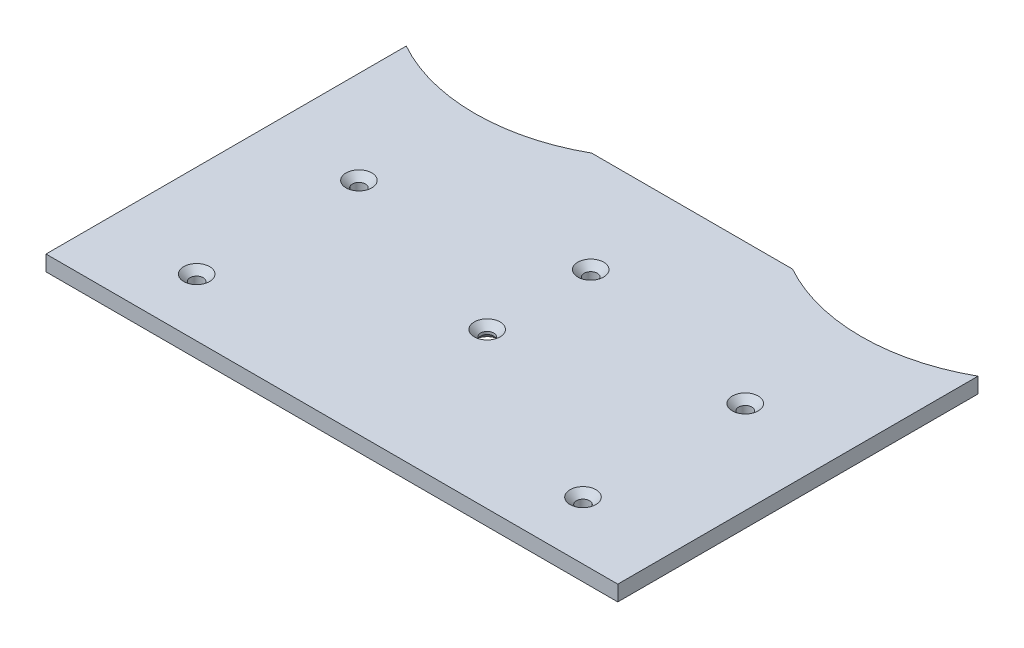
ISO-10303-21;
HEADER;
FILE_DESCRIPTION(('STEP AP214'),'2;1');
FILE_NAME('part.step','',(''),(''),'','','');
FILE_SCHEMA(('AUTOMOTIVE_DESIGN { 1 0 10303 214 1 1 1 1 }'));
ENDSEC;
DATA;
#1=APPLICATION_CONTEXT('core data for automotive mechanical design processes');
#2=APPLICATION_PROTOCOL_DEFINITION('international standard','automotive_design',2000,#1);
#3=PRODUCT_CONTEXT('',#1,'mechanical');
#4=PRODUCT('Part','Part','',(#3));
#5=PRODUCT_RELATED_PRODUCT_CATEGORY('part','',(#4));
#6=PRODUCT_DEFINITION_FORMATION('','',#4);
#7=PRODUCT_DEFINITION_CONTEXT('part definition',#1,'design');
#8=PRODUCT_DEFINITION('design','',#6,#7);
#9=PRODUCT_DEFINITION_SHAPE('','',#8);
#10=(LENGTH_UNIT() NAMED_UNIT(*) SI_UNIT(.MILLI.,.METRE.));
#11=(NAMED_UNIT(*) PLANE_ANGLE_UNIT() SI_UNIT($,.RADIAN.));
#12=(NAMED_UNIT(*) SI_UNIT($,.STERADIAN.) SOLID_ANGLE_UNIT());
#13=UNCERTAINTY_MEASURE_WITH_UNIT(LENGTH_MEASURE(1.E-05),#10,'distance_accuracy_value','');
#14=(GEOMETRIC_REPRESENTATION_CONTEXT(3) GLOBAL_UNCERTAINTY_ASSIGNED_CONTEXT((#13)) GLOBAL_UNIT_ASSIGNED_CONTEXT((#10,
#11,#12)) REPRESENTATION_CONTEXT('',''));
#15=CARTESIAN_POINT('',(0.,0.,0.));
#16=DIRECTION('',(0.,0.,1.));
#17=DIRECTION('',(1.,0.,0.));
#18=AXIS2_PLACEMENT_3D('',#15,#16,#17);
#19=CARTESIAN_POINT('',(50.,4.,-92.75));
#20=DIRECTION('',(0.,-1.,0.));
#21=DIRECTION('',(0.,0.,-1.));
#22=AXIS2_PLACEMENT_3D('',#19,#20,#21);
#23=CYLINDRICAL_SURFACE('',#22,49.25);
#24=CARTESIAN_POINT('',(50.,0.,-92.75));
#25=DIRECTION('',(0.,-1.,0.));
#26=DIRECTION('',(0.,0.,-1.));
#27=AXIS2_PLACEMENT_3D('',#24,#25,#26);
#28=CIRCLE('',#27,49.25);
#29=CARTESIAN_POINT('',(74.,0.,-49.7434597997002));
#30=VERTEX_POINT('',#29);
#31=CARTESIAN_POINT('',(26.0000000000001,0.,-49.7434597997002));
#32=VERTEX_POINT('',#31);
#33=EDGE_CURVE('E137',#30,#32,#28,.T.);
#34=ORIENTED_EDGE('',*,*,#33,.T.);
#35=DIRECTION('',(0.,-1.,0.));
#36=VECTOR('',#35,1.);
#37=CARTESIAN_POINT('',(26.0000000000001,4.,-49.7434597997002));
#38=LINE('',#37,#36);
#39=CARTESIAN_POINT('',(26.0000000000001,4.,-49.7434597997002));
#40=VERTEX_POINT('',#39);
#41=EDGE_CURVE('E159',#40,#32,#38,.T.);
#42=ORIENTED_EDGE('',*,*,#41,.F.);
#43=CARTESIAN_POINT('',(50.,4.,-92.75));
#44=DIRECTION('',(0.,-1.,0.));
#45=DIRECTION('',(0.,0.,-1.));
#46=AXIS2_PLACEMENT_3D('',#43,#44,#45);
#47=CIRCLE('',#46,49.25);
#48=CARTESIAN_POINT('',(74.,4.,-49.7434597997002));
#49=VERTEX_POINT('',#48);
#50=EDGE_CURVE('E98',#49,#40,#47,.T.);
#51=ORIENTED_EDGE('',*,*,#50,.F.);
#52=DIRECTION('',(0.,-1.,0.));
#53=VECTOR('',#52,1.);
#54=CARTESIAN_POINT('',(74.,4.,-49.7434597997002));
#55=LINE('',#54,#53);
#56=EDGE_CURVE('E163',#49,#30,#55,.T.);
#57=ORIENTED_EDGE('',*,*,#56,.T.);
#58=EDGE_LOOP('',(#34,#42,#51,#57));
#59=FACE_BOUND('',#58,.T.);
#60=ADVANCED_FACE('F41',(#59),#23,.F.);
#61=CARTESIAN_POINT('',(-26.0000000000001,4.,-49.7434597997002));
#62=DIRECTION('',(0.,0.,1.));
#63=DIRECTION('',(1.,0.,0.));
#64=AXIS2_PLACEMENT_3D('',#61,#62,#63);
#65=PLANE('',#64);
#66=DIRECTION('',(-1.,0.,0.));
#67=VECTOR('',#66,1.);
#68=CARTESIAN_POINT('',(-26.0000000000001,0.,-49.7434597997002));
#69=LINE('',#68,#67);
#70=CARTESIAN_POINT('',(-26.0000000000001,0.,-49.7434597997002));
#71=VERTEX_POINT('',#70);
#72=EDGE_CURVE('E140',#32,#71,#69,.T.);
#73=ORIENTED_EDGE('',*,*,#72,.T.);
#74=DIRECTION('',(0.,-1.,0.));
#75=VECTOR('',#74,1.);
#76=CARTESIAN_POINT('',(-26.0000000000001,4.,-49.7434597997002));
#77=LINE('',#76,#75);
#78=CARTESIAN_POINT('',(-26.0000000000001,4.,-49.7434597997002));
#79=VERTEX_POINT('',#78);
#80=EDGE_CURVE('E124',#79,#71,#77,.T.);
#81=ORIENTED_EDGE('',*,*,#80,.F.);
#82=DIRECTION('',(-1.,0.,0.));
#83=VECTOR('',#82,1.);
#84=CARTESIAN_POINT('',(-26.0000000000001,4.,-49.7434597997002));
#85=LINE('',#84,#83);
#86=EDGE_CURVE('E112',#40,#79,#85,.T.);
#87=ORIENTED_EDGE('',*,*,#86,.F.);
#88=ORIENTED_EDGE('',*,*,#41,.T.);
#89=EDGE_LOOP('',(#73,#81,#87,#88));
#90=FACE_BOUND('',#89,.T.);
#91=ADVANCED_FACE('F235',(#90),#65,.F.);
#92=CARTESIAN_POINT('',(-50.,4.,-92.75));
#93=DIRECTION('',(0.,-1.,0.));
#94=DIRECTION('',(0.,0.,-1.));
#95=AXIS2_PLACEMENT_3D('',#92,#93,#94);
#96=CYLINDRICAL_SURFACE('',#95,49.25);
#97=CARTESIAN_POINT('',(-50.,0.,-92.75));
#98=DIRECTION('',(0.,-1.,0.));
#99=DIRECTION('',(0.,0.,1.));
#100=AXIS2_PLACEMENT_3D('',#97,#98,#99);
#101=CIRCLE('',#100,49.25);
#102=CARTESIAN_POINT('',(-74.,0.,-49.7434597997002));
#103=VERTEX_POINT('',#102);
#104=EDGE_CURVE('E122',#71,#103,#101,.T.);
#105=ORIENTED_EDGE('',*,*,#104,.T.);
#106=DIRECTION('',(0.,-1.,0.));
#107=VECTOR('',#106,1.);
#108=CARTESIAN_POINT('',(-74.,4.,-49.7434597997002));
#109=LINE('',#108,#107);
#110=CARTESIAN_POINT('',(-74.,4.,-49.7434597997002));
#111=VERTEX_POINT('',#110);
#112=EDGE_CURVE('E119',#111,#103,#109,.T.);
#113=ORIENTED_EDGE('',*,*,#112,.F.);
#114=CARTESIAN_POINT('',(-50.,4.,-92.75));
#115=DIRECTION('',(0.,-1.,0.));
#116=DIRECTION('',(0.,0.,1.));
#117=AXIS2_PLACEMENT_3D('',#114,#115,#116);
#118=CIRCLE('',#117,49.25);
#119=EDGE_CURVE('E106',#79,#111,#118,.T.);
#120=ORIENTED_EDGE('',*,*,#119,.F.);
#121=ORIENTED_EDGE('',*,*,#80,.T.);
#122=EDGE_LOOP('',(#105,#113,#120,#121));
#123=FACE_BOUND('',#122,.T.);
#124=ADVANCED_FACE('F120',(#123),#96,.F.);
#125=CARTESIAN_POINT('',(-74.,4.,43.5));
#126=DIRECTION('',(1.,0.,0.));
#127=DIRECTION('',(0.,0.,-1.));
#128=AXIS2_PLACEMENT_3D('',#125,#126,#127);
#129=PLANE('',#128);
#130=DIRECTION('',(0.,0.,1.));
#131=VECTOR('',#130,1.);
#132=CARTESIAN_POINT('',(-74.,0.,43.5));
#133=LINE('',#132,#131);
#134=CARTESIAN_POINT('',(-74.,0.,43.5));
#135=VERTEX_POINT('',#134);
#136=EDGE_CURVE('E83',#103,#135,#133,.T.);
#137=ORIENTED_EDGE('',*,*,#136,.T.);
#138=DIRECTION('',(0.,-1.,0.));
#139=VECTOR('',#138,1.);
#140=CARTESIAN_POINT('',(-74.,4.,43.5));
#141=LINE('',#140,#139);
#142=CARTESIAN_POINT('',(-74.,4.,43.5));
#143=VERTEX_POINT('',#142);
#144=EDGE_CURVE('E125',#143,#135,#141,.T.);
#145=ORIENTED_EDGE('',*,*,#144,.F.);
#146=DIRECTION('',(0.,0.,1.));
#147=VECTOR('',#146,1.);
#148=CARTESIAN_POINT('',(-74.,4.,-43.5));
#149=LINE('',#148,#147);
#150=EDGE_CURVE('E110',#111,#143,#149,.T.);
#151=ORIENTED_EDGE('',*,*,#150,.F.);
#152=ORIENTED_EDGE('',*,*,#112,.T.);
#153=EDGE_LOOP('',(#137,#145,#151,#152));
#154=FACE_BOUND('',#153,.T.);
#155=ADVANCED_FACE('F127',(#154),#129,.F.);
#156=CARTESIAN_POINT('',(-74.,4.,43.5));
#157=DIRECTION('',(0.,0.,-1.));
#158=DIRECTION('',(-1.,0.,0.));
#159=AXIS2_PLACEMENT_3D('',#156,#157,#158);
#160=PLANE('',#159);
#161=DIRECTION('',(1.,0.,0.));
#162=VECTOR('',#161,1.);
#163=CARTESIAN_POINT('',(-74.,0.,43.5));
#164=LINE('',#163,#162);
#165=CARTESIAN_POINT('',(74.,0.,43.5));
#166=VERTEX_POINT('',#165);
#167=EDGE_CURVE('E90',#135,#166,#164,.T.);
#168=ORIENTED_EDGE('',*,*,#167,.T.);
#169=DIRECTION('',(0.,-1.,0.));
#170=VECTOR('',#169,1.);
#171=CARTESIAN_POINT('',(74.,4.,43.5));
#172=LINE('',#171,#170);
#173=CARTESIAN_POINT('',(74.,4.,43.5));
#174=VERTEX_POINT('',#173);
#175=EDGE_CURVE('E133',#174,#166,#172,.T.);
#176=ORIENTED_EDGE('',*,*,#175,.F.);
#177=DIRECTION('',(1.,0.,0.));
#178=VECTOR('',#177,1.);
#179=CARTESIAN_POINT('',(-74.,4.,43.5));
#180=LINE('',#179,#178);
#181=EDGE_CURVE('E130',#143,#174,#180,.T.);
#182=ORIENTED_EDGE('',*,*,#181,.F.);
#183=ORIENTED_EDGE('',*,*,#144,.T.);
#184=EDGE_LOOP('',(#168,#176,#182,#183));
#185=FACE_BOUND('',#184,.T.);
#186=ADVANCED_FACE('F319',(#185),#160,.F.);
#187=CARTESIAN_POINT('',(74.,4.,43.5));
#188=DIRECTION('',(-1.,0.,0.));
#189=DIRECTION('',(0.,0.,1.));
#190=AXIS2_PLACEMENT_3D('',#187,#188,#189);
#191=PLANE('',#190);
#192=DIRECTION('',(0.,0.,-1.));
#193=VECTOR('',#192,1.);
#194=CARTESIAN_POINT('',(74.,0.,43.5));
#195=LINE('',#194,#193);
#196=EDGE_CURVE('E150',#166,#30,#195,.T.);
#197=ORIENTED_EDGE('',*,*,#196,.T.);
#198=ORIENTED_EDGE('',*,*,#56,.F.);
#199=DIRECTION('',(0.,0.,-1.));
#200=VECTOR('',#199,1.);
#201=CARTESIAN_POINT('',(74.,4.,-49.7434597997002));
#202=LINE('',#201,#200);
#203=EDGE_CURVE('E60',#174,#49,#202,.T.);
#204=ORIENTED_EDGE('',*,*,#203,.F.);
#205=ORIENTED_EDGE('',*,*,#175,.T.);
#206=EDGE_LOOP('',(#197,#198,#204,#205));
#207=FACE_BOUND('',#206,.T.);
#208=ADVANCED_FACE('F318',(#207),#191,.F.);
#209=CARTESIAN_POINT('',(-50.,4.,-92.75));
#210=DIRECTION('',(0.,1.,0.));
#211=DIRECTION('',(0.,0.,1.));
#212=AXIS2_PLACEMENT_3D('',#209,#210,#211);
#213=PLANE('',#212);
#214=CARTESIAN_POINT('',(0.,4.,3.3));
#215=DIRECTION('',(0.,1.,0.));
#216=DIRECTION('',(0.,0.,1.));
#217=AXIS2_PLACEMENT_3D('',#214,#215,#216);
#218=CIRCLE('',#217,3.34999999999998);
#219=CARTESIAN_POINT('',(0.,4.,6.64999999999998));
#220=VERTEX_POINT('',#219);
#221=EDGE_CURVE('E194',#220,#220,#218,.F.);
#222=ORIENTED_EDGE('',*,*,#221,.T.);
#223=EDGE_LOOP('',(#222));
#224=FACE_BOUND('',#223,.T.);
#225=CARTESIAN_POINT('',(50.,4.,28.5));
#226=DIRECTION('',(0.,1.,0.));
#227=DIRECTION('',(0.,0.,1.));
#228=AXIS2_PLACEMENT_3D('',#225,#226,#227);
#229=CIRCLE('',#228,3.35000000000001);
#230=CARTESIAN_POINT('',(50.,4.,31.85));
#231=VERTEX_POINT('',#230);
#232=EDGE_CURVE('E190',#231,#231,#229,.F.);
#233=ORIENTED_EDGE('',*,*,#232,.T.);
#234=EDGE_LOOP('',(#233));
#235=FACE_BOUND('',#234,.T.);
#236=CARTESIAN_POINT('',(50.,4.,-13.5));
#237=DIRECTION('',(0.,1.,0.));
#238=DIRECTION('',(0.,0.,1.));
#239=AXIS2_PLACEMENT_3D('',#236,#237,#238);
#240=CIRCLE('',#239,3.35000000000001);
#241=CARTESIAN_POINT('',(50.,4.,-10.15));
#242=VERTEX_POINT('',#241);
#243=EDGE_CURVE('E186',#242,#242,#240,.F.);
#244=ORIENTED_EDGE('',*,*,#243,.T.);
#245=EDGE_LOOP('',(#244));
#246=FACE_BOUND('',#245,.T.);
#247=CARTESIAN_POINT('',(0.,4.,-23.5));
#248=DIRECTION('',(0.,1.,0.));
#249=DIRECTION('',(0.,0.,1.));
#250=AXIS2_PLACEMENT_3D('',#247,#248,#249);
#251=CIRCLE('',#250,3.34999999999998);
#252=CARTESIAN_POINT('',(0.,4.,-20.15));
#253=VERTEX_POINT('',#252);
#254=EDGE_CURVE('E182',#253,#253,#251,.F.);
#255=ORIENTED_EDGE('',*,*,#254,.T.);
#256=EDGE_LOOP('',(#255));
#257=FACE_BOUND('',#256,.T.);
#258=CARTESIAN_POINT('',(-50.,4.,28.5));
#259=DIRECTION('',(0.,1.,0.));
#260=DIRECTION('',(0.,0.,1.));
#261=AXIS2_PLACEMENT_3D('',#258,#259,#260);
#262=CIRCLE('',#261,3.35000000000001);
#263=CARTESIAN_POINT('',(-50.,4.,31.85));
#264=VERTEX_POINT('',#263);
#265=EDGE_CURVE('E178',#264,#264,#262,.F.);
#266=ORIENTED_EDGE('',*,*,#265,.T.);
#267=EDGE_LOOP('',(#266));
#268=FACE_BOUND('',#267,.T.);
#269=CARTESIAN_POINT('',(-50.,4.,-13.5));
#270=DIRECTION('',(0.,1.,0.));
#271=DIRECTION('',(0.,0.,1.));
#272=AXIS2_PLACEMENT_3D('',#269,#270,#271);
#273=CIRCLE('',#272,3.35000000000001);
#274=CARTESIAN_POINT('',(-50.,4.,-10.15));
#275=VERTEX_POINT('',#274);
#276=EDGE_CURVE('E174',#275,#275,#273,.F.);
#277=ORIENTED_EDGE('',*,*,#276,.T.);
#278=EDGE_LOOP('',(#277));
#279=FACE_BOUND('',#278,.T.);
#280=ORIENTED_EDGE('',*,*,#203,.T.);
#281=ORIENTED_EDGE('',*,*,#50,.T.);
#282=ORIENTED_EDGE('',*,*,#86,.T.);
#283=ORIENTED_EDGE('',*,*,#119,.T.);
#284=ORIENTED_EDGE('',*,*,#150,.T.);
#285=ORIENTED_EDGE('',*,*,#181,.T.);
#286=EDGE_LOOP('',(#280,#281,#282,#283,#284,#285));
#287=FACE_BOUND('',#286,.T.);
#288=ADVANCED_FACE('F108',(#224,#235,#246,#257,#268,#279,#287),#213,.T.);
#289=CARTESIAN_POINT('',(-50.,0.,-92.75));
#290=DIRECTION('',(0.,1.,0.));
#291=DIRECTION('',(0.,0.,1.));
#292=AXIS2_PLACEMENT_3D('',#289,#290,#291);
#293=PLANE('',#292);
#294=CARTESIAN_POINT('',(0.,0.,3.3));
#295=DIRECTION('',(0.,1.,0.));
#296=DIRECTION('',(0.,0.,1.));
#297=AXIS2_PLACEMENT_3D('',#294,#295,#296);
#298=CIRCLE('',#297,3.35000000000001);
#299=CARTESIAN_POINT('',(0.,0.,6.65000000000001));
#300=VERTEX_POINT('',#299);
#301=EDGE_CURVE('E210',#300,#300,#298,.T.);
#302=ORIENTED_EDGE('',*,*,#301,.T.);
#303=EDGE_LOOP('',(#302));
#304=FACE_BOUND('',#303,.T.);
#305=CARTESIAN_POINT('',(50.,0.,28.5));
#306=DIRECTION('',(0.,1.,0.));
#307=DIRECTION('',(0.,0.,1.));
#308=AXIS2_PLACEMENT_3D('',#305,#306,#307);
#309=CIRCLE('',#308,1.7);
#310=CARTESIAN_POINT('',(50.,0.,30.2));
#311=VERTEX_POINT('',#310);
#312=EDGE_CURVE('E295',#311,#311,#309,.F.);
#313=ORIENTED_EDGE('',*,*,#312,.F.);
#314=EDGE_LOOP('',(#313));
#315=FACE_BOUND('',#314,.T.);
#316=CARTESIAN_POINT('',(0.,0.,-23.5));
#317=DIRECTION('',(0.,1.,0.));
#318=DIRECTION('',(0.,0.,1.));
#319=AXIS2_PLACEMENT_3D('',#316,#317,#318);
#320=CIRCLE('',#319,1.7);
#321=CARTESIAN_POINT('',(0.,0.,-21.8));
#322=VERTEX_POINT('',#321);
#323=EDGE_CURVE('E291',#322,#322,#320,.F.);
#324=ORIENTED_EDGE('',*,*,#323,.F.);
#325=EDGE_LOOP('',(#324));
#326=FACE_BOUND('',#325,.T.);
#327=CARTESIAN_POINT('',(-50.,0.,-13.5));
#328=DIRECTION('',(0.,1.,0.));
#329=DIRECTION('',(0.,0.,1.));
#330=AXIS2_PLACEMENT_3D('',#327,#328,#329);
#331=CIRCLE('',#330,1.7);
#332=CARTESIAN_POINT('',(-50.,0.,-11.8));
#333=VERTEX_POINT('',#332);
#334=EDGE_CURVE('E294',#333,#333,#331,.F.);
#335=ORIENTED_EDGE('',*,*,#334,.F.);
#336=EDGE_LOOP('',(#335));
#337=FACE_BOUND('',#336,.T.);
#338=CARTESIAN_POINT('',(50.,0.,-13.5));
#339=DIRECTION('',(0.,1.,0.));
#340=DIRECTION('',(0.,0.,1.));
#341=AXIS2_PLACEMENT_3D('',#338,#339,#340);
#342=CIRCLE('',#341,1.7);
#343=CARTESIAN_POINT('',(50.,0.,-11.8));
#344=VERTEX_POINT('',#343);
#345=EDGE_CURVE('E302',#344,#344,#342,.F.);
#346=ORIENTED_EDGE('',*,*,#345,.F.);
#347=EDGE_LOOP('',(#346));
#348=FACE_BOUND('',#347,.T.);
#349=CARTESIAN_POINT('',(-50.,0.,28.5));
#350=DIRECTION('',(0.,1.,0.));
#351=DIRECTION('',(0.,0.,1.));
#352=AXIS2_PLACEMENT_3D('',#349,#350,#351);
#353=CIRCLE('',#352,1.7);
#354=CARTESIAN_POINT('',(-50.,0.,30.2));
#355=VERTEX_POINT('',#354);
#356=EDGE_CURVE('E141',#355,#355,#353,.F.);
#357=ORIENTED_EDGE('',*,*,#356,.F.);
#358=EDGE_LOOP('',(#357));
#359=FACE_BOUND('',#358,.T.);
#360=ORIENTED_EDGE('',*,*,#33,.F.);
#361=ORIENTED_EDGE('',*,*,#196,.F.);
#362=ORIENTED_EDGE('',*,*,#167,.F.);
#363=ORIENTED_EDGE('',*,*,#136,.F.);
#364=ORIENTED_EDGE('',*,*,#104,.F.);
#365=ORIENTED_EDGE('',*,*,#72,.F.);
#366=EDGE_LOOP('',(#360,#361,#362,#363,#364,#365));
#367=FACE_BOUND('',#366,.T.);
#368=ADVANCED_FACE('F316',(#304,#315,#326,#337,#348,#359,#367),#293,.F.);
#369=CARTESIAN_POINT('',(-50.,-4.80832611206852,28.5));
#370=DIRECTION('',(0.,1.,0.));
#371=DIRECTION('',(0.,0.,1.));
#372=AXIS2_PLACEMENT_3D('',#369,#370,#371);
#373=CYLINDRICAL_SURFACE('',#372,1.7);
#374=CARTESIAN_POINT('',(-50.,2.35,28.5));
#375=DIRECTION('',(0.,1.,0.));
#376=DIRECTION('',(0.,0.,1.));
#377=AXIS2_PLACEMENT_3D('',#374,#375,#376);
#378=CIRCLE('',#377,1.7);
#379=CARTESIAN_POINT('',(-50.,2.35,30.2));
#380=VERTEX_POINT('',#379);
#381=EDGE_CURVE('E52',#380,#380,#378,.T.);
#382=ORIENTED_EDGE('',*,*,#381,.T.);
#383=EDGE_LOOP('',(#382));
#384=FACE_BOUND('',#383,.T.);
#385=ORIENTED_EDGE('',*,*,#356,.T.);
#386=EDGE_LOOP('',(#385));
#387=FACE_BOUND('',#386,.T.);
#388=ADVANCED_FACE('F217',(#384,#387),#373,.F.);
#389=CARTESIAN_POINT('',(50.,-4.80832611206852,-13.5));
#390=DIRECTION('',(0.,1.,0.));
#391=DIRECTION('',(0.,0.,1.));
#392=AXIS2_PLACEMENT_3D('',#389,#390,#391);
#393=CYLINDRICAL_SURFACE('',#392,1.7);
#394=CARTESIAN_POINT('',(50.,2.35,-13.5));
#395=DIRECTION('',(0.,1.,0.));
#396=DIRECTION('',(0.,0.,1.));
#397=AXIS2_PLACEMENT_3D('',#394,#395,#396);
#398=CIRCLE('',#397,1.7);
#399=CARTESIAN_POINT('',(50.,2.35,-11.8));
#400=VERTEX_POINT('',#399);
#401=EDGE_CURVE('E202',#400,#400,#398,.T.);
#402=ORIENTED_EDGE('',*,*,#401,.T.);
#403=EDGE_LOOP('',(#402));
#404=FACE_BOUND('',#403,.T.);
#405=ORIENTED_EDGE('',*,*,#345,.T.);
#406=EDGE_LOOP('',(#405));
#407=FACE_BOUND('',#406,.T.);
#408=ADVANCED_FACE('F376',(#404,#407),#393,.F.);
#409=CARTESIAN_POINT('',(-50.,-4.80832611206852,-13.5));
#410=DIRECTION('',(0.,1.,0.));
#411=DIRECTION('',(0.,0.,1.));
#412=AXIS2_PLACEMENT_3D('',#409,#410,#411);
#413=CYLINDRICAL_SURFACE('',#412,1.7);
#414=CARTESIAN_POINT('',(-50.,2.35,-13.5));
#415=DIRECTION('',(0.,1.,0.));
#416=DIRECTION('',(0.,0.,1.));
#417=AXIS2_PLACEMENT_3D('',#414,#415,#416);
#418=CIRCLE('',#417,1.7);
#419=CARTESIAN_POINT('',(-50.,2.35,-11.8));
#420=VERTEX_POINT('',#419);
#421=EDGE_CURVE('E11',#420,#420,#418,.T.);
#422=ORIENTED_EDGE('',*,*,#421,.T.);
#423=EDGE_LOOP('',(#422));
#424=FACE_BOUND('',#423,.T.);
#425=ORIENTED_EDGE('',*,*,#334,.T.);
#426=EDGE_LOOP('',(#425));
#427=FACE_BOUND('',#426,.T.);
#428=ADVANCED_FACE('F385',(#424,#427),#413,.F.);
#429=CARTESIAN_POINT('',(0.,-4.80832611206852,3.3));
#430=DIRECTION('',(0.,1.,0.));
#431=DIRECTION('',(0.,0.,1.));
#432=AXIS2_PLACEMENT_3D('',#429,#430,#431);
#433=CYLINDRICAL_SURFACE('',#432,1.7);
#434=CARTESIAN_POINT('',(0.,2.35000000000002,3.3));
#435=DIRECTION('',(0.,1.,0.));
#436=DIRECTION('',(0.,0.,1.));
#437=AXIS2_PLACEMENT_3D('',#434,#435,#436);
#438=CIRCLE('',#437,1.7);
#439=CARTESIAN_POINT('',(0.,2.35000000000002,5.));
#440=VERTEX_POINT('',#439);
#441=EDGE_CURVE('E170',#440,#440,#438,.T.);
#442=ORIENTED_EDGE('',*,*,#441,.T.);
#443=EDGE_LOOP('',(#442));
#444=FACE_BOUND('',#443,.T.);
#445=CARTESIAN_POINT('',(0.,1.65,3.3));
#446=DIRECTION('',(0.,1.,0.));
#447=DIRECTION('',(0.,0.,1.));
#448=AXIS2_PLACEMENT_3D('',#445,#446,#447);
#449=CIRCLE('',#448,1.7);
#450=CARTESIAN_POINT('',(0.,1.65,5.));
#451=VERTEX_POINT('',#450);
#452=EDGE_CURVE('E166',#451,#451,#449,.F.);
#453=ORIENTED_EDGE('',*,*,#452,.T.);
#454=EDGE_LOOP('',(#453));
#455=FACE_BOUND('',#454,.T.);
#456=ADVANCED_FACE('F287',(#444,#455),#433,.F.);
#457=CARTESIAN_POINT('',(0.,-4.80832611206852,-23.5));
#458=DIRECTION('',(0.,1.,0.));
#459=DIRECTION('',(0.,0.,1.));
#460=AXIS2_PLACEMENT_3D('',#457,#458,#459);
#461=CYLINDRICAL_SURFACE('',#460,1.7);
#462=CARTESIAN_POINT('',(0.,2.35000000000002,-23.5));
#463=DIRECTION('',(0.,1.,0.));
#464=DIRECTION('',(0.,0.,1.));
#465=AXIS2_PLACEMENT_3D('',#462,#463,#464);
#466=CIRCLE('',#465,1.7);
#467=CARTESIAN_POINT('',(0.,2.35000000000002,-21.8));
#468=VERTEX_POINT('',#467);
#469=EDGE_CURVE('E206',#468,#468,#466,.T.);
#470=ORIENTED_EDGE('',*,*,#469,.T.);
#471=EDGE_LOOP('',(#470));
#472=FACE_BOUND('',#471,.T.);
#473=ORIENTED_EDGE('',*,*,#323,.T.);
#474=EDGE_LOOP('',(#473));
#475=FACE_BOUND('',#474,.T.);
#476=ADVANCED_FACE('F284',(#472,#475),#461,.F.);
#477=CARTESIAN_POINT('',(50.,-4.80832611206852,28.5));
#478=DIRECTION('',(0.,1.,0.));
#479=DIRECTION('',(0.,0.,1.));
#480=AXIS2_PLACEMENT_3D('',#477,#478,#479);
#481=CYLINDRICAL_SURFACE('',#480,1.7);
#482=CARTESIAN_POINT('',(50.,2.35,28.5));
#483=DIRECTION('',(0.,1.,0.));
#484=DIRECTION('',(0.,0.,1.));
#485=AXIS2_PLACEMENT_3D('',#482,#483,#484);
#486=CIRCLE('',#485,1.7);
#487=CARTESIAN_POINT('',(50.,2.35,30.2));
#488=VERTEX_POINT('',#487);
#489=EDGE_CURVE('E198',#488,#488,#486,.T.);
#490=ORIENTED_EDGE('',*,*,#489,.T.);
#491=EDGE_LOOP('',(#490));
#492=FACE_BOUND('',#491,.T.);
#493=ORIENTED_EDGE('',*,*,#312,.T.);
#494=EDGE_LOOP('',(#493));
#495=FACE_BOUND('',#494,.T.);
#496=ADVANCED_FACE('F252',(#492,#495),#481,.F.);
#497=CARTESIAN_POINT('',(0.,2.35000000000002,3.3));
#498=DIRECTION('',(0.,1.,0.));
#499=DIRECTION('',(0.,0.,1.));
#500=AXIS2_PLACEMENT_3D('',#497,#498,#499);
#501=CONICAL_SURFACE('',#500,1.7,0.785398163397446);
#502=ORIENTED_EDGE('',*,*,#221,.F.);
#503=EDGE_LOOP('',(#502));
#504=FACE_BOUND('',#503,.T.);
#505=ORIENTED_EDGE('',*,*,#441,.F.);
#506=EDGE_LOOP('',(#505));
#507=FACE_BOUND('',#506,.T.);
#508=ADVANCED_FACE('F245',(#504,#507),#501,.F.);
#509=CARTESIAN_POINT('',(50.,2.35,28.5));
#510=DIRECTION('',(0.,1.,0.));
#511=DIRECTION('',(0.,0.,1.));
#512=AXIS2_PLACEMENT_3D('',#509,#510,#511);
#513=CONICAL_SURFACE('',#512,1.7,0.785398163397451);
#514=ORIENTED_EDGE('',*,*,#232,.F.);
#515=EDGE_LOOP('',(#514));
#516=FACE_BOUND('',#515,.T.);
#517=ORIENTED_EDGE('',*,*,#489,.F.);
#518=EDGE_LOOP('',(#517));
#519=FACE_BOUND('',#518,.T.);
#520=ADVANCED_FACE('F251',(#516,#519),#513,.F.);
#521=CARTESIAN_POINT('',(50.,2.35,-13.5));
#522=DIRECTION('',(0.,1.,0.));
#523=DIRECTION('',(0.,0.,1.));
#524=AXIS2_PLACEMENT_3D('',#521,#522,#523);
#525=CONICAL_SURFACE('',#524,1.7,0.785398163397451);
#526=ORIENTED_EDGE('',*,*,#243,.F.);
#527=EDGE_LOOP('',(#526));
#528=FACE_BOUND('',#527,.T.);
#529=ORIENTED_EDGE('',*,*,#401,.F.);
#530=EDGE_LOOP('',(#529));
#531=FACE_BOUND('',#530,.T.);
#532=ADVANCED_FACE('F259',(#528,#531),#525,.F.);
#533=CARTESIAN_POINT('',(0.,2.35000000000002,-23.5));
#534=DIRECTION('',(0.,1.,0.));
#535=DIRECTION('',(0.,0.,1.));
#536=AXIS2_PLACEMENT_3D('',#533,#534,#535);
#537=CONICAL_SURFACE('',#536,1.7,0.785398163397446);
#538=ORIENTED_EDGE('',*,*,#254,.F.);
#539=EDGE_LOOP('',(#538));
#540=FACE_BOUND('',#539,.T.);
#541=ORIENTED_EDGE('',*,*,#469,.F.);
#542=EDGE_LOOP('',(#541));
#543=FACE_BOUND('',#542,.T.);
#544=ADVANCED_FACE('F229',(#540,#543),#537,.F.);
#545=CARTESIAN_POINT('',(0.,1.65,3.3));
#546=DIRECTION('',(0.,-1.,0.));
#547=DIRECTION('',(0.,0.,-1.));
#548=AXIS2_PLACEMENT_3D('',#545,#546,#547);
#549=CONICAL_SURFACE('',#548,1.7,0.785398163397451);
#550=ORIENTED_EDGE('',*,*,#301,.F.);
#551=EDGE_LOOP('',(#550));
#552=FACE_BOUND('',#551,.T.);
#553=ORIENTED_EDGE('',*,*,#452,.F.);
#554=EDGE_LOOP('',(#553));
#555=FACE_BOUND('',#554,.T.);
#556=ADVANCED_FACE('F222',(#552,#555),#549,.F.);
#557=CARTESIAN_POINT('',(-50.,2.35,28.5));
#558=DIRECTION('',(0.,1.,0.));
#559=DIRECTION('',(0.,0.,1.));
#560=AXIS2_PLACEMENT_3D('',#557,#558,#559);
#561=CONICAL_SURFACE('',#560,1.7,0.785398163397451);
#562=ORIENTED_EDGE('',*,*,#265,.F.);
#563=EDGE_LOOP('',(#562));
#564=FACE_BOUND('',#563,.T.);
#565=ORIENTED_EDGE('',*,*,#381,.F.);
#566=EDGE_LOOP('',(#565));
#567=FACE_BOUND('',#566,.T.);
#568=ADVANCED_FACE('F220',(#564,#567),#561,.F.);
#569=CARTESIAN_POINT('',(-50.,2.35,-13.5));
#570=DIRECTION('',(0.,1.,0.));
#571=DIRECTION('',(0.,0.,1.));
#572=AXIS2_PLACEMENT_3D('',#569,#570,#571);
#573=CONICAL_SURFACE('',#572,1.7,0.785398163397451);
#574=ORIENTED_EDGE('',*,*,#276,.F.);
#575=EDGE_LOOP('',(#574));
#576=FACE_BOUND('',#575,.T.);
#577=ORIENTED_EDGE('',*,*,#421,.F.);
#578=EDGE_LOOP('',(#577));
#579=FACE_BOUND('',#578,.T.);
#580=ADVANCED_FACE('F44',(#576,#579),#573,.F.);
#581=CLOSED_SHELL('',(#60,#91,#124,#155,#186,#208,#288,#368,#388,#408,#428,#456,#476,#496,#508,
#520,#532,#544,#556,#568,#580));
#582=MANIFOLD_SOLID_BREP('B2',#581);
#583=ADVANCED_BREP_SHAPE_REPRESENTATION('',(#18,#582),#14);
#584=SHAPE_DEFINITION_REPRESENTATION(#9,#583);
ENDSEC;
END-ISO-10303-21;
